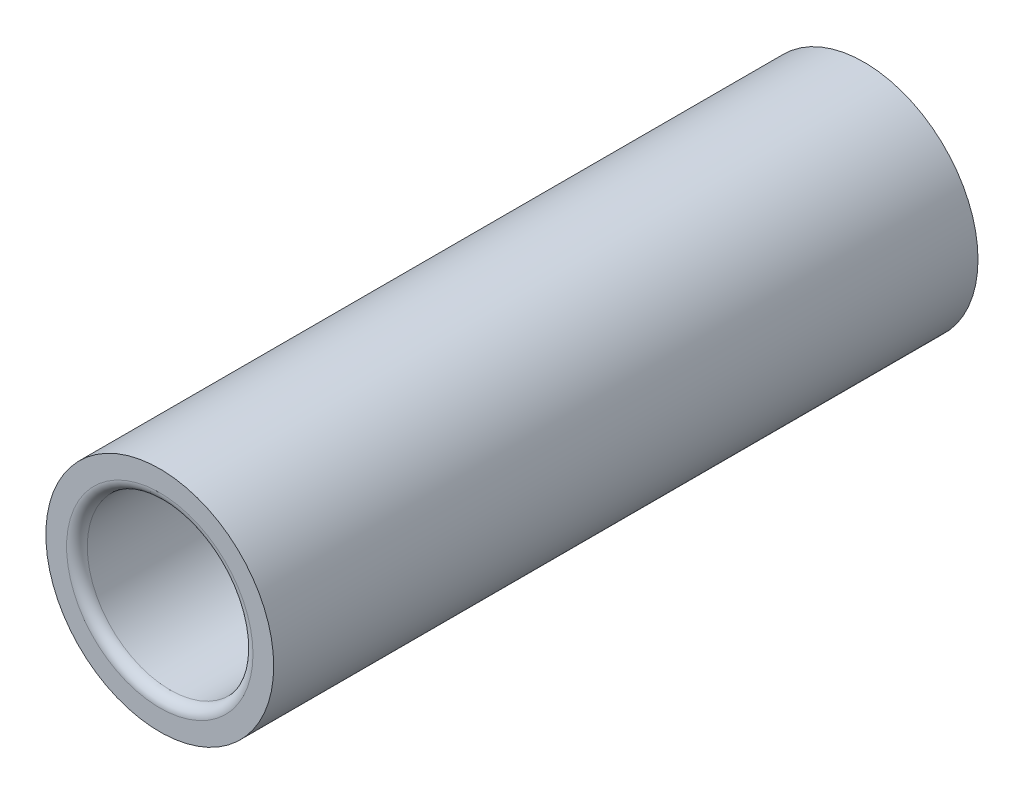
ISO-10303-21;
HEADER;
FILE_DESCRIPTION(('STEP AP214'),'2;1');
FILE_NAME('part.step','',(''),(''),'','','');
FILE_SCHEMA(('AUTOMOTIVE_DESIGN { 1 0 10303 214 1 1 1 1 }'));
ENDSEC;
DATA;
#1=APPLICATION_CONTEXT('core data for automotive mechanical design processes');
#2=APPLICATION_PROTOCOL_DEFINITION('international standard','automotive_design',2000,#1);
#3=PRODUCT_CONTEXT('',#1,'mechanical');
#4=PRODUCT('Part','Part','',(#3));
#5=PRODUCT_RELATED_PRODUCT_CATEGORY('part','',(#4));
#6=PRODUCT_DEFINITION_FORMATION('','',#4);
#7=PRODUCT_DEFINITION_CONTEXT('part definition',#1,'design');
#8=PRODUCT_DEFINITION('design','',#6,#7);
#9=PRODUCT_DEFINITION_SHAPE('','',#8);
#10=(LENGTH_UNIT() NAMED_UNIT(*) SI_UNIT(.MILLI.,.METRE.));
#11=(NAMED_UNIT(*) PLANE_ANGLE_UNIT() SI_UNIT($,.RADIAN.));
#12=(NAMED_UNIT(*) SI_UNIT($,.STERADIAN.) SOLID_ANGLE_UNIT());
#13=UNCERTAINTY_MEASURE_WITH_UNIT(LENGTH_MEASURE(1.E-05),#10,'distance_accuracy_value','');
#14=(GEOMETRIC_REPRESENTATION_CONTEXT(3) GLOBAL_UNCERTAINTY_ASSIGNED_CONTEXT((#13)) GLOBAL_UNIT_ASSIGNED_CONTEXT((#10,
#11,#12)) REPRESENTATION_CONTEXT('',''));
#15=CARTESIAN_POINT('',(0.,0.,0.));
#16=DIRECTION('',(0.,0.,1.));
#17=DIRECTION('',(1.,0.,0.));
#18=AXIS2_PLACEMENT_3D('',#15,#16,#17);
#19=CARTESIAN_POINT('',(0.,0.,34.));
#20=DIRECTION('',(0.,0.,1.));
#21=DIRECTION('',(1.,0.,0.));
#22=AXIS2_PLACEMENT_3D('',#19,#20,#21);
#23=PLANE('',#22);
#24=CARTESIAN_POINT('',(0.,0.,34.));
#25=DIRECTION('',(0.,0.,1.));
#26=DIRECTION('',(1.,0.,0.));
#27=AXIS2_PLACEMENT_3D('',#24,#25,#26);
#28=CIRCLE('',#27,9.);
#29=CARTESIAN_POINT('',(9.,0.,34.));
#30=VERTEX_POINT('',#29);
#31=EDGE_CURVE('E10',#30,#30,#28,.F.);
#32=ORIENTED_EDGE('',*,*,#31,.T.);
#33=EDGE_LOOP('',(#32));
#34=FACE_BOUND('',#33,.T.);
#35=CARTESIAN_POINT('',(0.,0.,34.));
#36=DIRECTION('',(0.,0.,1.));
#37=DIRECTION('',(1.,0.,0.));
#38=AXIS2_PLACEMENT_3D('',#35,#36,#37);
#39=CIRCLE('',#38,11.);
#40=CARTESIAN_POINT('',(11.,0.,34.));
#41=VERTEX_POINT('',#40);
#42=EDGE_CURVE('E57',#41,#41,#39,.T.);
#43=ORIENTED_EDGE('',*,*,#42,.T.);
#44=EDGE_LOOP('',(#43));
#45=FACE_BOUND('',#44,.T.);
#46=ADVANCED_FACE('F37',(#34,#45),#23,.T.);
#47=CARTESIAN_POINT('',(0.,0.,-34.));
#48=DIRECTION('',(0.,0.,1.));
#49=DIRECTION('',(1.,0.,0.));
#50=AXIS2_PLACEMENT_3D('',#47,#48,#49);
#51=PLANE('',#50);
#52=CARTESIAN_POINT('',(0.,0.,-34.));
#53=DIRECTION('',(0.,0.,1.));
#54=DIRECTION('',(1.,0.,0.));
#55=AXIS2_PLACEMENT_3D('',#52,#53,#54);
#56=CIRCLE('',#55,9.);
#57=CARTESIAN_POINT('',(9.,0.,-34.));
#58=VERTEX_POINT('',#57);
#59=EDGE_CURVE('E52',#58,#58,#56,.T.);
#60=ORIENTED_EDGE('',*,*,#59,.T.);
#61=EDGE_LOOP('',(#60));
#62=FACE_BOUND('',#61,.T.);
#63=CARTESIAN_POINT('',(0.,0.,-34.));
#64=DIRECTION('',(0.,0.,1.));
#65=DIRECTION('',(1.,0.,0.));
#66=AXIS2_PLACEMENT_3D('',#63,#64,#65);
#67=CIRCLE('',#66,11.);
#68=CARTESIAN_POINT('',(11.,0.,-34.));
#69=VERTEX_POINT('',#68);
#70=EDGE_CURVE('E58',#69,#69,#67,.T.);
#71=ORIENTED_EDGE('',*,*,#70,.F.);
#72=EDGE_LOOP('',(#71));
#73=FACE_BOUND('',#72,.T.);
#74=ADVANCED_FACE('F69',(#62,#73),#51,.F.);
#75=CARTESIAN_POINT('',(0.,0.,34.));
#76=DIRECTION('',(0.,0.,-1.));
#77=DIRECTION('',(-1.,0.,0.));
#78=AXIS2_PLACEMENT_3D('',#75,#76,#77);
#79=CYLINDRICAL_SURFACE('',#78,11.);
#80=ORIENTED_EDGE('',*,*,#42,.F.);
#81=EDGE_LOOP('',(#80));
#82=FACE_BOUND('',#81,.T.);
#83=ORIENTED_EDGE('',*,*,#70,.T.);
#84=EDGE_LOOP('',(#83));
#85=FACE_BOUND('',#84,.T.);
#86=ADVANCED_FACE('F65',(#82,#85),#79,.T.);
#87=CARTESIAN_POINT('',(0.,0.,34.));
#88=DIRECTION('',(0.,0.,-1.));
#89=DIRECTION('',(-1.,0.,0.));
#90=AXIS2_PLACEMENT_3D('',#87,#88,#89);
#91=CYLINDRICAL_SURFACE('',#90,8.);
#92=CARTESIAN_POINT('',(0.,0.,-33.));
#93=DIRECTION('',(0.,0.,1.));
#94=DIRECTION('',(1.,0.,0.));
#95=AXIS2_PLACEMENT_3D('',#92,#93,#94);
#96=CIRCLE('',#95,8.);
#97=CARTESIAN_POINT('',(8.,0.,-33.));
#98=VERTEX_POINT('',#97);
#99=EDGE_CURVE('E44',#98,#98,#96,.F.);
#100=ORIENTED_EDGE('',*,*,#99,.T.);
#101=EDGE_LOOP('',(#100));
#102=FACE_BOUND('',#101,.T.);
#103=CARTESIAN_POINT('',(0.,0.,33.));
#104=DIRECTION('',(0.,0.,1.));
#105=DIRECTION('',(1.,0.,0.));
#106=AXIS2_PLACEMENT_3D('',#103,#104,#105);
#107=CIRCLE('',#106,8.);
#108=CARTESIAN_POINT('',(8.,0.,33.));
#109=VERTEX_POINT('',#108);
#110=EDGE_CURVE('E48',#109,#109,#107,.T.);
#111=ORIENTED_EDGE('',*,*,#110,.T.);
#112=EDGE_LOOP('',(#111));
#113=FACE_BOUND('',#112,.T.);
#114=ADVANCED_FACE('F68',(#102,#113),#91,.F.);
#115=CARTESIAN_POINT('',(0.,0.,-33.));
#116=DIRECTION('',(0.,0.,1.));
#117=DIRECTION('',(1.,0.,0.));
#118=AXIS2_PLACEMENT_3D('',#115,#116,#117);
#119=TOROIDAL_SURFACE('',#118,9.,1.);
#120=ORIENTED_EDGE('',*,*,#99,.F.);
#121=EDGE_LOOP('',(#120));
#122=FACE_BOUND('',#121,.T.);
#123=ORIENTED_EDGE('',*,*,#59,.F.);
#124=EDGE_LOOP('',(#123));
#125=FACE_BOUND('',#124,.T.);
#126=ADVANCED_FACE('F81',(#122,#125),#119,.T.);
#127=CARTESIAN_POINT('',(0.,0.,33.));
#128=DIRECTION('',(0.,0.,1.));
#129=DIRECTION('',(1.,0.,0.));
#130=AXIS2_PLACEMENT_3D('',#127,#128,#129);
#131=TOROIDAL_SURFACE('',#130,9.,1.);
#132=ORIENTED_EDGE('',*,*,#31,.F.);
#133=EDGE_LOOP('',(#132));
#134=FACE_BOUND('',#133,.T.);
#135=ORIENTED_EDGE('',*,*,#110,.F.);
#136=EDGE_LOOP('',(#135));
#137=FACE_BOUND('',#136,.T.);
#138=ADVANCED_FACE('F39',(#134,#137),#131,.T.);
#139=CLOSED_SHELL('',(#46,#74,#86,#114,#126,#138));
#140=MANIFOLD_SOLID_BREP('B2',#139);
#141=ADVANCED_BREP_SHAPE_REPRESENTATION('',(#18,#140),#14);
#142=SHAPE_DEFINITION_REPRESENTATION(#9,#141);
ENDSEC;
END-ISO-10303-21;
